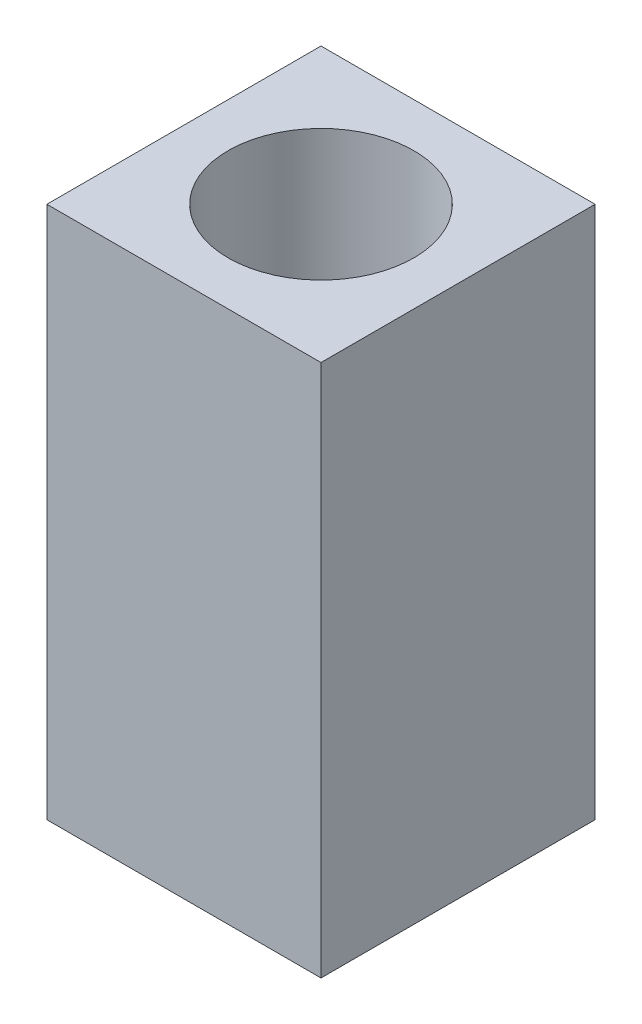
ISO-10303-21;
HEADER;
FILE_DESCRIPTION(('STEP AP214'),'2;1');
FILE_NAME('part.step','',(''),(''),'','','');
FILE_SCHEMA(('AUTOMOTIVE_DESIGN { 1 0 10303 214 1 1 1 1 }'));
ENDSEC;
DATA;
#1=APPLICATION_CONTEXT('core data for automotive mechanical design processes');
#2=APPLICATION_PROTOCOL_DEFINITION('international standard','automotive_design',2000,#1);
#3=PRODUCT_CONTEXT('',#1,'mechanical');
#4=PRODUCT('Part','Part','',(#3));
#5=PRODUCT_RELATED_PRODUCT_CATEGORY('part','',(#4));
#6=PRODUCT_DEFINITION_FORMATION('','',#4);
#7=PRODUCT_DEFINITION_CONTEXT('part definition',#1,'design');
#8=PRODUCT_DEFINITION('design','',#6,#7);
#9=PRODUCT_DEFINITION_SHAPE('','',#8);
#10=(LENGTH_UNIT() NAMED_UNIT(*) SI_UNIT(.MILLI.,.METRE.));
#11=(NAMED_UNIT(*) PLANE_ANGLE_UNIT() SI_UNIT($,.RADIAN.));
#12=(NAMED_UNIT(*) SI_UNIT($,.STERADIAN.) SOLID_ANGLE_UNIT());
#13=UNCERTAINTY_MEASURE_WITH_UNIT(LENGTH_MEASURE(1.E-05),#10,'distance_accuracy_value','');
#14=(GEOMETRIC_REPRESENTATION_CONTEXT(3) GLOBAL_UNCERTAINTY_ASSIGNED_CONTEXT((#13)) GLOBAL_UNIT_ASSIGNED_CONTEXT((#10,
#11,#12)) REPRESENTATION_CONTEXT('',''));
#15=CARTESIAN_POINT('',(0.,0.,0.));
#16=DIRECTION('',(0.,0.,1.));
#17=DIRECTION('',(1.,0.,0.));
#18=AXIS2_PLACEMENT_3D('',#15,#16,#17);
#19=CARTESIAN_POINT('',(0.,35.,0.));
#20=DIRECTION('',(0.,-1.,0.));
#21=DIRECTION('',(0.,0.,-1.));
#22=AXIS2_PLACEMENT_3D('',#19,#20,#21);
#23=PLANE('',#22);
#24=DIRECTION('',(0.,0.,1.));
#25=VECTOR('',#24,1.);
#26=CARTESIAN_POINT('',(0.,35.,0.));
#27=LINE('',#26,#25);
#28=CARTESIAN_POINT('',(0.,35.,-18.));
#29=VERTEX_POINT('',#28);
#30=CARTESIAN_POINT('',(0.,35.,0.));
#31=VERTEX_POINT('',#30);
#32=EDGE_CURVE('E90',#29,#31,#27,.T.);
#33=ORIENTED_EDGE('',*,*,#32,.T.);
#34=DIRECTION('',(1.,0.,0.));
#35=VECTOR('',#34,1.);
#36=CARTESIAN_POINT('',(0.,35.,0.));
#37=LINE('',#36,#35);
#38=CARTESIAN_POINT('',(18.,35.,0.));
#39=VERTEX_POINT('',#38);
#40=EDGE_CURVE('E85',#31,#39,#37,.T.);
#41=ORIENTED_EDGE('',*,*,#40,.T.);
#42=DIRECTION('',(0.,0.,-1.));
#43=VECTOR('',#42,1.);
#44=CARTESIAN_POINT('',(18.,35.,0.));
#45=LINE('',#44,#43);
#46=CARTESIAN_POINT('',(18.,35.,-18.));
#47=VERTEX_POINT('',#46);
#48=EDGE_CURVE('E88',#39,#47,#45,.T.);
#49=ORIENTED_EDGE('',*,*,#48,.T.);
#50=DIRECTION('',(-1.,0.,0.));
#51=VECTOR('',#50,1.);
#52=CARTESIAN_POINT('',(0.,35.,-18.));
#53=LINE('',#52,#51);
#54=EDGE_CURVE('E55',#47,#29,#53,.T.);
#55=ORIENTED_EDGE('',*,*,#54,.T.);
#56=EDGE_LOOP('',(#33,#41,#49,#55));
#57=FACE_BOUND('',#56,.T.);
#58=CARTESIAN_POINT('',(9.,35.,-9.));
#59=DIRECTION('',(0.,1.,0.));
#60=DIRECTION('',(0.,0.,1.));
#61=AXIS2_PLACEMENT_3D('',#58,#59,#60);
#62=CIRCLE('',#61,6.1);
#63=CARTESIAN_POINT('',(9.,35.,-2.9));
#64=VERTEX_POINT('',#63);
#65=EDGE_CURVE('E105',#64,#64,#62,.T.);
#66=ORIENTED_EDGE('',*,*,#65,.F.);
#67=EDGE_LOOP('',(#66));
#68=FACE_BOUND('',#67,.T.);
#69=ADVANCED_FACE('F38',(#57,#68),#23,.F.);
#70=CARTESIAN_POINT('',(0.,0.,0.));
#71=DIRECTION('',(0.,-1.,0.));
#72=DIRECTION('',(0.,0.,-1.));
#73=AXIS2_PLACEMENT_3D('',#70,#71,#72);
#74=PLANE('',#73);
#75=DIRECTION('',(0.,0.,1.));
#76=VECTOR('',#75,1.);
#77=CARTESIAN_POINT('',(0.,0.,0.));
#78=LINE('',#77,#76);
#79=CARTESIAN_POINT('',(0.,0.,-18.));
#80=VERTEX_POINT('',#79);
#81=CARTESIAN_POINT('',(0.,0.,0.));
#82=VERTEX_POINT('',#81);
#83=EDGE_CURVE('E102',#80,#82,#78,.T.);
#84=ORIENTED_EDGE('',*,*,#83,.F.);
#85=DIRECTION('',(-1.,0.,0.));
#86=VECTOR('',#85,1.);
#87=CARTESIAN_POINT('',(0.,0.,-18.));
#88=LINE('',#87,#86);
#89=CARTESIAN_POINT('',(18.,0.,-18.));
#90=VERTEX_POINT('',#89);
#91=EDGE_CURVE('E78',#90,#80,#88,.T.);
#92=ORIENTED_EDGE('',*,*,#91,.F.);
#93=DIRECTION('',(0.,0.,-1.));
#94=VECTOR('',#93,1.);
#95=CARTESIAN_POINT('',(18.,0.,0.));
#96=LINE('',#95,#94);
#97=CARTESIAN_POINT('',(18.,0.,0.));
#98=VERTEX_POINT('',#97);
#99=EDGE_CURVE('E72',#98,#90,#96,.T.);
#100=ORIENTED_EDGE('',*,*,#99,.F.);
#101=DIRECTION('',(1.,0.,0.));
#102=VECTOR('',#101,1.);
#103=CARTESIAN_POINT('',(0.,0.,0.));
#104=LINE('',#103,#102);
#105=EDGE_CURVE('E94',#82,#98,#104,.T.);
#106=ORIENTED_EDGE('',*,*,#105,.F.);
#107=EDGE_LOOP('',(#84,#92,#100,#106));
#108=FACE_BOUND('',#107,.T.);
#109=CARTESIAN_POINT('',(9.,0.,-9.));
#110=DIRECTION('',(0.,1.,0.));
#111=DIRECTION('',(0.,0.,1.));
#112=AXIS2_PLACEMENT_3D('',#109,#110,#111);
#113=CIRCLE('',#112,6.1);
#114=CARTESIAN_POINT('',(9.,0.,-2.9));
#115=VERTEX_POINT('',#114);
#116=EDGE_CURVE('E117',#115,#115,#113,.T.);
#117=ORIENTED_EDGE('',*,*,#116,.T.);
#118=EDGE_LOOP('',(#117));
#119=FACE_BOUND('',#118,.T.);
#120=ADVANCED_FACE('F113',(#108,#119),#74,.T.);
#121=CARTESIAN_POINT('',(0.,35.,0.));
#122=DIRECTION('',(1.,0.,0.));
#123=DIRECTION('',(0.,0.,-1.));
#124=AXIS2_PLACEMENT_3D('',#121,#122,#123);
#125=PLANE('',#124);
#126=ORIENTED_EDGE('',*,*,#83,.T.);
#127=DIRECTION('',(0.,-1.,0.));
#128=VECTOR('',#127,1.);
#129=CARTESIAN_POINT('',(0.,35.,0.));
#130=LINE('',#129,#128);
#131=EDGE_CURVE('E11',#31,#82,#130,.T.);
#132=ORIENTED_EDGE('',*,*,#131,.F.);
#133=ORIENTED_EDGE('',*,*,#32,.F.);
#134=DIRECTION('',(0.,-1.,0.));
#135=VECTOR('',#134,1.);
#136=CARTESIAN_POINT('',(0.,35.,-18.));
#137=LINE('',#136,#135);
#138=EDGE_CURVE('E98',#29,#80,#137,.T.);
#139=ORIENTED_EDGE('',*,*,#138,.T.);
#140=EDGE_LOOP('',(#126,#132,#133,#139));
#141=FACE_BOUND('',#140,.T.);
#142=ADVANCED_FACE('F40',(#141),#125,.F.);
#143=CARTESIAN_POINT('',(0.,35.,0.));
#144=DIRECTION('',(0.,0.,-1.));
#145=DIRECTION('',(-1.,0.,0.));
#146=AXIS2_PLACEMENT_3D('',#143,#144,#145);
#147=PLANE('',#146);
#148=ORIENTED_EDGE('',*,*,#105,.T.);
#149=DIRECTION('',(0.,-1.,0.));
#150=VECTOR('',#149,1.);
#151=CARTESIAN_POINT('',(18.,35.,0.));
#152=LINE('',#151,#150);
#153=EDGE_CURVE('E47',#39,#98,#152,.T.);
#154=ORIENTED_EDGE('',*,*,#153,.F.);
#155=ORIENTED_EDGE('',*,*,#40,.F.);
#156=ORIENTED_EDGE('',*,*,#131,.T.);
#157=EDGE_LOOP('',(#148,#154,#155,#156));
#158=FACE_BOUND('',#157,.T.);
#159=ADVANCED_FACE('F93',(#158),#147,.F.);
#160=CARTESIAN_POINT('',(18.,35.,0.));
#161=DIRECTION('',(-1.,0.,0.));
#162=DIRECTION('',(0.,0.,1.));
#163=AXIS2_PLACEMENT_3D('',#160,#161,#162);
#164=PLANE('',#163);
#165=ORIENTED_EDGE('',*,*,#99,.T.);
#166=DIRECTION('',(0.,-1.,0.));
#167=VECTOR('',#166,1.);
#168=CARTESIAN_POINT('',(18.,35.,-18.));
#169=LINE('',#168,#167);
#170=EDGE_CURVE('E95',#47,#90,#169,.T.);
#171=ORIENTED_EDGE('',*,*,#170,.F.);
#172=ORIENTED_EDGE('',*,*,#48,.F.);
#173=ORIENTED_EDGE('',*,*,#153,.T.);
#174=EDGE_LOOP('',(#165,#171,#172,#173));
#175=FACE_BOUND('',#174,.T.);
#176=ADVANCED_FACE('F96',(#175),#164,.F.);
#177=CARTESIAN_POINT('',(0.,35.,-18.));
#178=DIRECTION('',(0.,0.,1.));
#179=DIRECTION('',(1.,0.,0.));
#180=AXIS2_PLACEMENT_3D('',#177,#178,#179);
#181=PLANE('',#180);
#182=ORIENTED_EDGE('',*,*,#91,.T.);
#183=ORIENTED_EDGE('',*,*,#138,.F.);
#184=ORIENTED_EDGE('',*,*,#54,.F.);
#185=ORIENTED_EDGE('',*,*,#170,.T.);
#186=EDGE_LOOP('',(#182,#183,#184,#185));
#187=FACE_BOUND('',#186,.T.);
#188=ADVANCED_FACE('F110',(#187),#181,.F.);
#189=CARTESIAN_POINT('',(9.,35.,-9.));
#190=DIRECTION('',(0.,-1.,0.));
#191=DIRECTION('',(0.,0.,-1.));
#192=AXIS2_PLACEMENT_3D('',#189,#190,#191);
#193=CYLINDRICAL_SURFACE('',#192,6.1);
#194=ORIENTED_EDGE('',*,*,#65,.T.);
#195=EDGE_LOOP('',(#194));
#196=FACE_BOUND('',#195,.T.);
#197=ORIENTED_EDGE('',*,*,#116,.F.);
#198=EDGE_LOOP('',(#197));
#199=FACE_BOUND('',#198,.T.);
#200=ADVANCED_FACE('F123',(#196,#199),#193,.F.);
#201=CLOSED_SHELL('',(#69,#120,#142,#159,#176,#188,#200));
#202=MANIFOLD_SOLID_BREP('B2',#201);
#203=ADVANCED_BREP_SHAPE_REPRESENTATION('',(#18,#202),#14);
#204=SHAPE_DEFINITION_REPRESENTATION(#9,#203);
ENDSEC;
END-ISO-10303-21;
